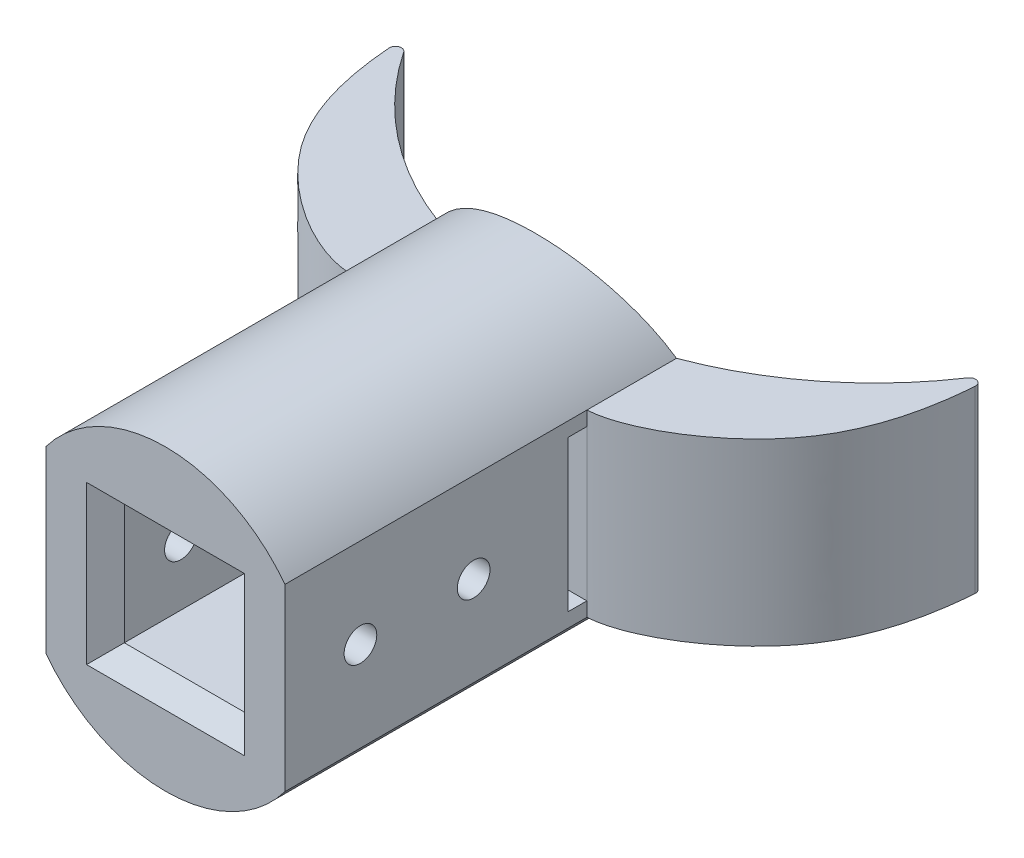
ISO-10303-21;
HEADER;
FILE_DESCRIPTION(('STEP AP214'),'2;1');
FILE_NAME('part.step','',(''),(''),'','','');
FILE_SCHEMA(('AUTOMOTIVE_DESIGN { 1 0 10303 214 1 1 1 1 }'));
ENDSEC;
DATA;
#1=APPLICATION_CONTEXT('core data for automotive mechanical design processes');
#2=APPLICATION_PROTOCOL_DEFINITION('international standard','automotive_design',2000,#1);
#3=PRODUCT_CONTEXT('',#1,'mechanical');
#4=PRODUCT('Part','Part','',(#3));
#5=PRODUCT_RELATED_PRODUCT_CATEGORY('part','',(#4));
#6=PRODUCT_DEFINITION_FORMATION('','',#4);
#7=PRODUCT_DEFINITION_CONTEXT('part definition',#1,'design');
#8=PRODUCT_DEFINITION('design','',#6,#7);
#9=PRODUCT_DEFINITION_SHAPE('','',#8);
#10=(LENGTH_UNIT() NAMED_UNIT(*) SI_UNIT(.MILLI.,.METRE.));
#11=(NAMED_UNIT(*) PLANE_ANGLE_UNIT() SI_UNIT($,.RADIAN.));
#12=(NAMED_UNIT(*) SI_UNIT($,.STERADIAN.) SOLID_ANGLE_UNIT());
#13=UNCERTAINTY_MEASURE_WITH_UNIT(LENGTH_MEASURE(1.E-05),#10,'distance_accuracy_value','');
#14=(GEOMETRIC_REPRESENTATION_CONTEXT(3) GLOBAL_UNCERTAINTY_ASSIGNED_CONTEXT((#13)) GLOBAL_UNIT_ASSIGNED_CONTEXT((#10,
#11,#12)) REPRESENTATION_CONTEXT('',''));
#15=CARTESIAN_POINT('',(0.,0.,0.));
#16=DIRECTION('',(0.,0.,1.));
#17=DIRECTION('',(1.,0.,0.));
#18=AXIS2_PLACEMENT_3D('',#15,#16,#17);
#19=CARTESIAN_POINT('',(10.1,35.2,-68.58));
#20=DIRECTION('',(0.,-1.,0.));
#21=DIRECTION('',(0.,0.,-1.));
#22=AXIS2_PLACEMENT_3D('',#19,#20,#21);
#23=CYLINDRICAL_SURFACE('',#22,57.15);
#24=CARTESIAN_POINT('',(10.1,-5.00000000000001,-68.58));
#25=DIRECTION('',(0.,1.,0.));
#26=DIRECTION('',(-1.,0.,0.));
#27=AXIS2_PLACEMENT_3D('',#24,#25,#26);
#28=CIRCLE('',#27,57.15);
#29=CARTESIAN_POINT('',(57.5657270757982,-5.,-36.7503400400533));
#30=VERTEX_POINT('',#29);
#31=CARTESIAN_POINT('',(30.2,-5.00000000000001,-15.0812850621625));
#32=VERTEX_POINT('',#31);
#33=EDGE_CURVE('E186',#30,#32,#28,.F.);
#34=ORIENTED_EDGE('',*,*,#33,.T.);
#35=CARTESIAN_POINT('',(-10.,-5.,-15.0812850621625));
#36=CARTESIAN_POINT('',(-9.569712332474,-5.56898872498957,-14.9196018283171));
#37=CARTESIAN_POINT('',(-9.11570132508639,-6.11911007857149,-14.7549670228426));
#38=CARTESIAN_POINT('',(-8.1629020495651,-7.17877848018616,-14.4242740941071));
#39=CARTESIAN_POINT('',(-7.66410811291156,-7.68832037631784,-14.2582157930764));
#40=CARTESIAN_POINT('',(-6.62262711435152,-8.66562351070631,-13.9285989864008));
#41=CARTESIAN_POINT('',(-6.07978660329882,-9.13322559182999,-13.765051806664));
#42=CARTESIAN_POINT('',(-5.23631168187311,-9.79927875036689,-13.5254310400344));
#43=CARTESIAN_POINT('',(-4.95028103813122,-10.0154069948205,-13.4465066138825));
#44=CARTESIAN_POINT('',(-4.36874205010276,-10.4356196002812,-13.2910442377158));
#45=CARTESIAN_POINT('',(-4.07323096328791,-10.6397004267944,-13.214506991132));
#46=CARTESIAN_POINT('',(-3.17219476778227,-11.2338693501222,-12.9890394362993));
#47=CARTESIAN_POINT('',(-2.55303439979543,-11.6051982189992,-12.8445023563047));
#48=CARTESIAN_POINT('',(-1.28240554188028,-12.2945740973537,-12.5712019196849));
#49=CARTESIAN_POINT('',(-0.630939178220956,-12.6126246074125,-12.4424375268865));
#50=CARTESIAN_POINT('',(0.366313383086268,-13.047117571051,-12.2640011701088));
#51=CARTESIAN_POINT('',(0.701706915265925,-13.1847280127073,-12.2070267275089));
#52=CARTESIAN_POINT('',(1.37875278707901,-13.4455707189697,-12.0983222412656));
#53=CARTESIAN_POINT('',(1.72040335199784,-13.5688069896999,-12.046590736929));
#54=CARTESIAN_POINT('',(2.75387813261316,-13.9164551255889,-11.8998412868026));
#55=CARTESIAN_POINT('',(3.45450132396692,-14.1189266643058,-11.8132185599554));
#56=CARTESIAN_POINT('',(4.64729128605659,-14.4080583604874,-11.6886347494299));
#57=CARTESIAN_POINT('',(5.13490275445733,-14.5110720990149,-11.6439587541232));
#58=CARTESIAN_POINT('',(6.11643079176066,-14.6881513850773,-11.5668799121503));
#59=CARTESIAN_POINT('',(6.61034811312223,-14.7622134439147,-11.5344785445999));
#60=CARTESIAN_POINT('',(7.60253922548987,-14.8809199087936,-11.4824337012582));
#61=CARTESIAN_POINT('',(8.10081442174288,-14.9255544423898,-11.4627945069954));
#62=CARTESIAN_POINT('',(9.09937599308318,-14.9850937460932,-11.4365773552659));
#63=CARTESIAN_POINT('',(9.5996620242112,-15.0000034005777,-11.4299972519366));
#64=CARTESIAN_POINT('',(10.7725165281108,-14.9999954292002,-11.4300036937393));
#65=CARTESIAN_POINT('',(11.4451269031158,-14.9730478794715,-11.4419004319034));
#66=CARTESIAN_POINT('',(12.7852853183273,-14.8655438624096,-11.4891812618554));
#67=CARTESIAN_POINT('',(13.4528323795908,-14.7849772827524,-11.5245697840919));
#68=CARTESIAN_POINT('',(14.7782037382921,-14.5710650327966,-11.6179207755132));
#69=CARTESIAN_POINT('',(15.4360222289414,-14.4376890638022,-11.6758962033327));
#70=CARTESIAN_POINT('',(16.7368192066626,-14.1195775410837,-11.8129066183442));
#71=CARTESIAN_POINT('',(17.379798343343,-13.9348442402179,-11.8919406817646));
#72=CARTESIAN_POINT('',(18.6447047616331,-13.5164901500572,-12.0687876549313));
#73=CARTESIAN_POINT('',(19.2666912640775,-13.2830230952584,-12.1665414336075));
#74=CARTESIAN_POINT('',(20.4879279453276,-12.7689387971464,-12.378597790476));
#75=CARTESIAN_POINT('',(21.0871775251444,-12.4883203127165,-12.4929008042652));
#76=CARTESIAN_POINT('',(22.2598524960107,-11.8820522652358,-12.7354012662615));
#77=CARTESIAN_POINT('',(22.8332653894269,-11.5563812130397,-12.8636053386399));
#78=CARTESIAN_POINT('',(23.9509956391608,-10.8624490827969,-13.1309006195354));
#79=CARTESIAN_POINT('',(24.4953141314787,-10.4941896694051,-13.2699914024539));
#80=CARTESIAN_POINT('',(25.5153268978302,-9.74455161689717,-13.5459234316245));
#81=CARTESIAN_POINT('',(25.9931591308689,-9.36588348711492,-13.6822438766443));
#82=CARTESIAN_POINT('',(26.9194626456226,-8.57558875333205,-13.9589249731525));
#83=CARTESIAN_POINT('',(27.3679351546028,-8.1639635285711,-14.0992854554098));
#84=CARTESIAN_POINT('',(28.2328668507241,-7.31043221696037,-14.3810328261166));
#85=CARTESIAN_POINT('',(28.6493879121895,-6.86858795977308,-14.5224171191221));
#86=CARTESIAN_POINT('',(29.4496851700661,-5.95571957094113,-14.8036816275328));
#87=CARTESIAN_POINT('',(29.8334608987263,-5.48469502263603,-14.9435618214278));
#88=CARTESIAN_POINT('',(30.2,-5.00000000000001,-15.0812850621625));
#89=B_SPLINE_CURVE_WITH_KNOTS('',3,(#35,#36,#37,#38,#39,#40,#41,#42,#43,#44,#45,#46,#47,#48,#49,
#50,#51,#52,#53,#54,#55,#56,#57,#58,#59,#60,#61,#62,#63,#64,#65,#66,#67,#68,#69,#70,#71,#72,#73,
#74,#75,#76,#77,#78,#79,#80,#81,#82,#83,#84,#85,#86,#87,#88),.UNSPECIFIED.,.F.,.F.,(4,2,2,2,2,2,
2,2,2,2,2,2,2,2,2,2,2,2,2,2,2,2,2,2,2,2,4),(0.,2.1936380553368,4.38755416883547,
6.58947177679666,7.69045483028555,8.79175930316771,10.9977578031182,13.2036113040757,
14.3042068886823,15.4044949973573,17.6041592018719,19.1043800548913,20.6047816298777,
22.1056863088473,23.606344339566,25.6234155544972,27.6408672884359,29.6594781900542,
31.6780005565699,33.6902490441192,35.7025505062395,37.7158151254793,39.7290010786523,
41.6016475353139,43.4742156634823,45.3430608618205,47.211932751237),.UNSPECIFIED.);
#90=CARTESIAN_POINT('',(-10.,-5.00000000000001,-15.0812850621625));
#91=VERTEX_POINT('',#90);
#92=EDGE_CURVE('E170',#91,#32,#89,.T.);
#93=ORIENTED_EDGE('',*,*,#92,.F.);
#94=CARTESIAN_POINT('',(10.1,-5.,-68.58));
#95=DIRECTION('',(0.,-1.,0.));
#96=DIRECTION('',(1.,0.,0.));
#97=AXIS2_PLACEMENT_3D('',#94,#95,#96);
#98=CIRCLE('',#97,57.15);
#99=CARTESIAN_POINT('',(-37.3657270757982,-5.,-36.7503400400533));
#100=VERTEX_POINT('',#99);
#101=EDGE_CURVE('E182',#100,#91,#98,.F.);
#102=ORIENTED_EDGE('',*,*,#101,.F.);
#103=DIRECTION('',(0.,-1.,0.));
#104=VECTOR('',#103,1.);
#105=CARTESIAN_POINT('',(-37.3657270757982,35.2,-36.7503400400533));
#106=LINE('',#105,#104);
#107=CARTESIAN_POINT('',(-37.3657270757982,25.2,-36.7503400400533));
#108=VERTEX_POINT('',#107);
#109=EDGE_CURVE('E447',#108,#100,#106,.T.);
#110=ORIENTED_EDGE('',*,*,#109,.F.);
#111=CARTESIAN_POINT('',(10.1,25.2,-68.58));
#112=DIRECTION('',(0.,-1.,0.));
#113=DIRECTION('',(1.,0.,0.));
#114=AXIS2_PLACEMENT_3D('',#111,#112,#113);
#115=CIRCLE('',#114,57.15);
#116=CARTESIAN_POINT('',(-9.99999999999999,25.2,-15.0812850621625));
#117=VERTEX_POINT('',#116);
#118=EDGE_CURVE('E252',#108,#117,#115,.F.);
#119=ORIENTED_EDGE('',*,*,#118,.T.);
#120=CARTESIAN_POINT('',(30.2,25.2,-15.0812850621625));
#121=CARTESIAN_POINT('',(29.769712332474,25.7689887249896,-14.919601828317));
#122=CARTESIAN_POINT('',(29.3157013250864,26.3191100785715,-14.7549670228426));
#123=CARTESIAN_POINT('',(28.3629020495651,27.3787784801862,-14.4242740941071));
#124=CARTESIAN_POINT('',(27.8641081129116,27.8883203763178,-14.2582157930764));
#125=CARTESIAN_POINT('',(26.8226271143515,28.8656235107063,-13.9285989864008));
#126=CARTESIAN_POINT('',(26.2797866032988,29.33322559183,-13.765051806664));
#127=CARTESIAN_POINT('',(25.4363116818731,29.9992787503669,-13.5254310400344));
#128=CARTESIAN_POINT('',(25.1502810381312,30.2154069948205,-13.4465066138825));
#129=CARTESIAN_POINT('',(24.5687420501028,30.6356196002812,-13.2910442377158));
#130=CARTESIAN_POINT('',(24.2732309632879,30.8397004267944,-13.214506991132));
#131=CARTESIAN_POINT('',(23.3721947677823,31.4338693501222,-12.9890394362993));
#132=CARTESIAN_POINT('',(22.7530343997954,31.8051982189992,-12.8445023563047));
#133=CARTESIAN_POINT('',(21.4824055418803,32.4945740973537,-12.5712019196849));
#134=CARTESIAN_POINT('',(20.830939178221,32.8126246074124,-12.4424375268865));
#135=CARTESIAN_POINT('',(19.8336866169137,33.247117571051,-12.2640011701088));
#136=CARTESIAN_POINT('',(19.4982930847341,33.3847280127073,-12.2070267275089));
#137=CARTESIAN_POINT('',(18.821247212921,33.6455707189697,-12.0983222412656));
#138=CARTESIAN_POINT('',(18.4795966480022,33.7688069896999,-12.046590736929));
#139=CARTESIAN_POINT('',(17.4461218673868,34.1164551255889,-11.8998412868026));
#140=CARTESIAN_POINT('',(16.7454986760331,34.3189266643058,-11.8132185599555));
#141=CARTESIAN_POINT('',(15.5527087139434,34.6080583604874,-11.6886347494299));
#142=CARTESIAN_POINT('',(15.0650972455427,34.7110720990149,-11.6439587541232));
#143=CARTESIAN_POINT('',(14.0835692082393,34.8881513850773,-11.5668799121503));
#144=CARTESIAN_POINT('',(13.5896518868778,34.9622134439147,-11.5344785445999));
#145=CARTESIAN_POINT('',(12.5974607745101,35.0809199087936,-11.4824337012582));
#146=CARTESIAN_POINT('',(12.0991855782571,35.1255544423898,-11.4627945069954));
#147=CARTESIAN_POINT('',(11.1006240069168,35.1850937460932,-11.4365773552659));
#148=CARTESIAN_POINT('',(10.6003379757888,35.2000034005777,-11.4299972519366));
#149=CARTESIAN_POINT('',(9.42748347188917,35.1999954292002,-11.4300036937393));
#150=CARTESIAN_POINT('',(8.75487309688416,35.1730478794715,-11.4419004319034));
#151=CARTESIAN_POINT('',(7.41471468167267,35.0655438624096,-11.4891812618554));
#152=CARTESIAN_POINT('',(6.74716762040917,34.9849772827524,-11.5245697840919));
#153=CARTESIAN_POINT('',(5.4217962617079,34.7710650327966,-11.6179207755132));
#154=CARTESIAN_POINT('',(4.76397777105858,34.6376890638021,-11.6758962033327));
#155=CARTESIAN_POINT('',(3.46318079333738,34.3195775410837,-11.8129066183442));
#156=CARTESIAN_POINT('',(2.82020165665698,34.1348442402179,-11.8919406817645));
#157=CARTESIAN_POINT('',(1.55529523836689,33.7164901500572,-12.0687876549313));
#158=CARTESIAN_POINT('',(0.933308735922529,33.4830230952584,-12.1665414336075));
#159=CARTESIAN_POINT('',(-0.287927945327568,32.9689387971464,-12.378597790476));
#160=CARTESIAN_POINT('',(-0.887177525144446,32.6883203127164,-12.4929008042652));
#161=CARTESIAN_POINT('',(-2.05985249601069,32.0820522652358,-12.7354012662615));
#162=CARTESIAN_POINT('',(-2.63326538942687,31.7563812130397,-12.8636053386399));
#163=CARTESIAN_POINT('',(-3.75099563916081,31.0624490827969,-13.1309006195354));
#164=CARTESIAN_POINT('',(-4.29531413147871,30.6941896694051,-13.2699914024539));
#165=CARTESIAN_POINT('',(-5.31532689783022,29.9445516168972,-13.5459234316245));
#166=CARTESIAN_POINT('',(-5.79315913086887,29.5658834871149,-13.6822438766443));
#167=CARTESIAN_POINT('',(-6.71946264562263,28.775588753332,-13.9589249731525));
#168=CARTESIAN_POINT('',(-7.16793515460278,28.3639635285711,-14.0992854554098));
#169=CARTESIAN_POINT('',(-8.03286685072415,27.5104322169604,-14.3810328261166));
#170=CARTESIAN_POINT('',(-8.44938791218949,27.0685879597731,-14.5224171191221));
#171=CARTESIAN_POINT('',(-9.24968517006615,26.1557195709411,-14.8036816275328));
#172=CARTESIAN_POINT('',(-9.63346089872629,25.684695022636,-14.9435618214278));
#173=CARTESIAN_POINT('',(-9.99999999999999,25.2,-15.0812850621625));
#174=B_SPLINE_CURVE_WITH_KNOTS('',3,(#120,#121,#122,#123,#124,#125,#126,#127,#128,#129,#130,
#131,#132,#133,#134,#135,#136,#137,#138,#139,#140,#141,#142,#143,#144,#145,#146,#147,#148,#149,
#150,#151,#152,#153,#154,#155,#156,#157,#158,#159,#160,#161,#162,#163,#164,#165,#166,#167,#168,
#169,#170,#171,#172,#173),.UNSPECIFIED.,.F.,.F.,(4,2,2,2,2,2,2,2,2,2,2,2,2,2,2,2,2,2,2,2,2,2,2,
2,2,2,4),(0.,2.1936380553368,4.38755416883547,6.58947177679666,7.69045483028554,
8.79175930316771,10.9977578031182,13.2036113040757,14.3042068886823,15.4044949973573,
17.6041592018719,19.1043800548913,20.6047816298777,22.1056863088473,23.606344339566,
25.6234155544972,27.6408672884359,29.6594781900543,31.6780005565699,33.6902490441192,
35.7025505062395,37.7158151254793,39.7290010786523,41.6016475353139,43.4742156634823,
45.3430608618205,47.211932751237),.UNSPECIFIED.);
#175=CARTESIAN_POINT('',(30.2,25.2,-15.0812850621625));
#176=VERTEX_POINT('',#175);
#177=EDGE_CURVE('E244',#176,#117,#174,.T.);
#178=ORIENTED_EDGE('',*,*,#177,.F.);
#179=CARTESIAN_POINT('',(10.1,25.2,-68.58));
#180=DIRECTION('',(0.,1.,0.));
#181=DIRECTION('',(-1.,0.,0.));
#182=AXIS2_PLACEMENT_3D('',#179,#180,#181);
#183=CIRCLE('',#182,57.15);
#184=CARTESIAN_POINT('',(57.5657270757982,25.2,-36.7503400400533));
#185=VERTEX_POINT('',#184);
#186=EDGE_CURVE('E581',#185,#176,#183,.F.);
#187=ORIENTED_EDGE('',*,*,#186,.F.);
#188=DIRECTION('',(0.,-1.,0.));
#189=VECTOR('',#188,1.);
#190=CARTESIAN_POINT('',(57.5657270757982,35.2,-36.7503400400533));
#191=LINE('',#190,#189);
#192=EDGE_CURVE('E195',#185,#30,#191,.T.);
#193=ORIENTED_EDGE('',*,*,#192,.T.);
#194=EDGE_LOOP('',(#34,#93,#102,#110,#119,#178,#187,#193));
#195=FACE_BOUND('',#194,.T.);
#196=ADVANCED_FACE('F32',(#195),#23,.F.);
#197=CARTESIAN_POINT('',(-38.196273481324,35.2,-36.193390609433));
#198=DIRECTION('',(0.,-1.,0.));
#199=DIRECTION('',(0.,0.,-1.));
#200=AXIS2_PLACEMENT_3D('',#197,#198,#199);
#201=CYLINDRICAL_SURFACE('',#200,0.999999999999999);
#202=CARTESIAN_POINT('',(-38.196273481324,-5.,-36.193390609433));
#203=DIRECTION('',(0.,-1.,0.));
#204=DIRECTION('',(1.,0.,0.));
#205=AXIS2_PLACEMENT_3D('',#202,#203,#204);
#206=CIRCLE('',#205,0.999999999999999);
#207=CARTESIAN_POINT('',(-39.1935140373091,-5.,-36.1191526575582));
#208=VERTEX_POINT('',#207);
#209=EDGE_CURVE('E209',#208,#100,#206,.T.);
#210=ORIENTED_EDGE('',*,*,#209,.F.);
#211=DIRECTION('',(0.,-1.,0.));
#212=VECTOR('',#211,1.);
#213=CARTESIAN_POINT('',(-39.1935140373091,35.2,-36.1191526575582));
#214=LINE('',#213,#212);
#215=CARTESIAN_POINT('',(-39.1935140373091,25.2,-36.1191526575582));
#216=VERTEX_POINT('',#215);
#217=EDGE_CURVE('E319',#216,#208,#214,.T.);
#218=ORIENTED_EDGE('',*,*,#217,.F.);
#219=CARTESIAN_POINT('',(-38.196273481324,25.2,-36.193390609433));
#220=DIRECTION('',(0.,-1.,0.));
#221=DIRECTION('',(1.,0.,0.));
#222=AXIS2_PLACEMENT_3D('',#219,#220,#221);
#223=CIRCLE('',#222,0.999999999999999);
#224=EDGE_CURVE('E429',#216,#108,#223,.T.);
#225=ORIENTED_EDGE('',*,*,#224,.T.);
#226=ORIENTED_EDGE('',*,*,#109,.T.);
#227=EDGE_LOOP('',(#210,#218,#225,#226));
#228=FACE_BOUND('',#227,.T.);
#229=ADVANCED_FACE('F384',(#228),#201,.T.);
#230=CARTESIAN_POINT('',(-39.1935140373091,35.2,-36.1191526575582));
#231=CARTESIAN_POINT('',(-38.7339626357244,35.2,-29.9459853806289));
#232=CARTESIAN_POINT('',(-35.680340128179,35.2,-11.9877721604459));
#233=CARTESIAN_POINT('',(-16.4831344739887,35.2,-0.377878078658248));
#234=CARTESIAN_POINT('',(-10.,35.2,0.));
#235=B_SPLINE_CURVE_WITH_KNOTS('',3,(#230,#231,#232,#233,#234),.UNSPECIFIED.,.F.,.F.,(4,1,4),
(0.,0.379882707345245,0.846265586941312),.UNSPECIFIED.);
#236=DIRECTION('',(0.,-1.,0.));
#237=VECTOR('',#236,1.);
#238=SURFACE_OF_LINEAR_EXTRUSION('',#235,#237);
#239=CARTESIAN_POINT('',(-39.1935140373091,-5.,-36.1191526575582));
#240=CARTESIAN_POINT('',(-38.7339626357244,-5.,-29.9459853806289));
#241=CARTESIAN_POINT('',(-35.680340128179,-5.,-11.9877721604459));
#242=CARTESIAN_POINT('',(-16.4831344739887,-5.,-0.377878078658248));
#243=CARTESIAN_POINT('',(-10.,-5.,0.));
#244=B_SPLINE_CURVE_WITH_KNOTS('',3,(#239,#240,#241,#242,#243),.UNSPECIFIED.,.F.,.F.,(4,1,4),
(0.,0.379882707345245,0.846265586941312),.UNSPECIFIED.);
#245=CARTESIAN_POINT('',(-10.,-5.00000000000001,0.));
#246=VERTEX_POINT('',#245);
#247=EDGE_CURVE('E197',#246,#208,#244,.F.);
#248=ORIENTED_EDGE('',*,*,#247,.F.);
#249=DIRECTION('',(0.,-1.,0.));
#250=VECTOR('',#249,1.);
#251=CARTESIAN_POINT('',(-10.,-5.,0.));
#252=LINE('',#251,#250);
#253=CARTESIAN_POINT('',(-10.,-2.6,0.));
#254=VERTEX_POINT('',#253);
#255=EDGE_CURVE('E462',#254,#246,#252,.T.);
#256=ORIENTED_EDGE('',*,*,#255,.F.);
#257=DIRECTION('',(0.,-1.,0.));
#258=VECTOR('',#257,1.);
#259=CARTESIAN_POINT('',(-10.,22.8,0.));
#260=LINE('',#259,#258);
#261=CARTESIAN_POINT('',(-10.,22.8,0.));
#262=VERTEX_POINT('',#261);
#263=EDGE_CURVE('E277',#262,#254,#260,.T.);
#264=ORIENTED_EDGE('',*,*,#263,.F.);
#265=CARTESIAN_POINT('',(-9.99999999999999,25.2,0.));
#266=VERTEX_POINT('',#265);
#267=EDGE_CURVE('E443',#266,#262,#252,.T.);
#268=ORIENTED_EDGE('',*,*,#267,.F.);
#269=CARTESIAN_POINT('',(-39.1935140373091,25.2,-36.1191526575582));
#270=CARTESIAN_POINT('',(-38.7339626357244,25.2,-29.9459853806289));
#271=CARTESIAN_POINT('',(-35.680340128179,25.2,-11.9877721604459));
#272=CARTESIAN_POINT('',(-16.4831344739887,25.2,-0.377878078658248));
#273=CARTESIAN_POINT('',(-10.,25.2,0.));
#274=B_SPLINE_CURVE_WITH_KNOTS('',3,(#269,#270,#271,#272,#273),.UNSPECIFIED.,.F.,.F.,(4,1,4),
(0.,0.379882707345245,0.846265586941312),.UNSPECIFIED.);
#275=EDGE_CURVE('E432',#266,#216,#274,.F.);
#276=ORIENTED_EDGE('',*,*,#275,.T.);
#277=ORIENTED_EDGE('',*,*,#217,.T.);
#278=EDGE_LOOP('',(#248,#256,#264,#268,#276,#277));
#279=FACE_BOUND('',#278,.T.);
#280=ADVANCED_FACE('F336',(#279),#238,.F.);
#281=CARTESIAN_POINT('',(30.2,35.2,0.));
#282=CARTESIAN_POINT('',(36.6831344739887,35.2,-0.377878078658248));
#283=CARTESIAN_POINT('',(55.880340128179,35.2,-11.9877721604459));
#284=CARTESIAN_POINT('',(58.9339626357243,35.2,-29.945985380629));
#285=CARTESIAN_POINT('',(59.3935140373091,35.2,-36.1191526575582));
#286=B_SPLINE_CURVE_WITH_KNOTS('',3,(#281,#282,#283,#284,#285),.UNSPECIFIED.,.F.,.F.,(4,1,4),
(0.,0.466382879596067,0.846265586941312),.UNSPECIFIED.);
#287=DIRECTION('',(0.,-1.,0.));
#288=VECTOR('',#287,1.);
#289=SURFACE_OF_LINEAR_EXTRUSION('',#286,#288);
#290=DIRECTION('',(0.,1.,0.));
#291=VECTOR('',#290,1.);
#292=CARTESIAN_POINT('',(30.2,-5.,0.));
#293=LINE('',#292,#291);
#294=CARTESIAN_POINT('',(30.2,-5.,0.));
#295=VERTEX_POINT('',#294);
#296=CARTESIAN_POINT('',(30.2,-2.6,0.));
#297=VERTEX_POINT('',#296);
#298=EDGE_CURVE('E467',#295,#297,#293,.T.);
#299=ORIENTED_EDGE('',*,*,#298,.F.);
#300=CARTESIAN_POINT('',(30.2,-5.00000000000001,0.));
#301=CARTESIAN_POINT('',(36.6831344739887,-5.00000000000001,-0.377878078658248));
#302=CARTESIAN_POINT('',(55.880340128179,-5.00000000000001,-11.9877721604459));
#303=CARTESIAN_POINT('',(58.9339626357243,-5.00000000000001,-29.945985380629));
#304=CARTESIAN_POINT('',(59.3935140373091,-5.00000000000001,-36.1191526575582));
#305=B_SPLINE_CURVE_WITH_KNOTS('',3,(#300,#301,#302,#303,#304),.UNSPECIFIED.,.F.,.F.,(4,1,4),
(0.,0.466382879596067,0.846265586941312),.UNSPECIFIED.);
#306=CARTESIAN_POINT('',(59.3935140373091,-5.,-36.1191526575582));
#307=VERTEX_POINT('',#306);
#308=EDGE_CURVE('E189',#295,#307,#305,.T.);
#309=ORIENTED_EDGE('',*,*,#308,.T.);
#310=DIRECTION('',(0.,-1.,0.));
#311=VECTOR('',#310,1.);
#312=CARTESIAN_POINT('',(59.3935140373091,35.2,-36.1191526575582));
#313=LINE('',#312,#311);
#314=CARTESIAN_POINT('',(59.3935140373091,25.2,-36.1191526575582));
#315=VERTEX_POINT('',#314);
#316=EDGE_CURVE('E451',#315,#307,#313,.T.);
#317=ORIENTED_EDGE('',*,*,#316,.F.);
#318=CARTESIAN_POINT('',(30.2,25.2,0.));
#319=CARTESIAN_POINT('',(36.6831344739887,25.2,-0.377878078658248));
#320=CARTESIAN_POINT('',(55.880340128179,25.2,-11.9877721604459));
#321=CARTESIAN_POINT('',(58.9339626357243,25.2,-29.945985380629));
#322=CARTESIAN_POINT('',(59.3935140373091,25.2,-36.1191526575582));
#323=B_SPLINE_CURVE_WITH_KNOTS('',3,(#318,#319,#320,#321,#322),.UNSPECIFIED.,.F.,.F.,(4,1,4),
(0.,0.466382879596067,0.846265586941312),.UNSPECIFIED.);
#324=CARTESIAN_POINT('',(30.2,25.2,0.));
#325=VERTEX_POINT('',#324);
#326=EDGE_CURVE('E559',#325,#315,#323,.T.);
#327=ORIENTED_EDGE('',*,*,#326,.F.);
#328=CARTESIAN_POINT('',(30.2,22.8,0.));
#329=VERTEX_POINT('',#328);
#330=EDGE_CURVE('E480',#329,#325,#293,.T.);
#331=ORIENTED_EDGE('',*,*,#330,.F.);
#332=DIRECTION('',(0.,-1.,0.));
#333=VECTOR('',#332,1.);
#334=CARTESIAN_POINT('',(30.2,35.2,0.));
#335=LINE('',#334,#333);
#336=EDGE_CURVE('E304',#329,#297,#335,.T.);
#337=ORIENTED_EDGE('',*,*,#336,.T.);
#338=EDGE_LOOP('',(#299,#309,#317,#327,#331,#337));
#339=FACE_BOUND('',#338,.T.);
#340=ADVANCED_FACE('F332',(#339),#289,.F.);
#341=CARTESIAN_POINT('',(58.396273481324,35.2,-36.1933906094331));
#342=DIRECTION('',(0.,-1.,0.));
#343=DIRECTION('',(0.,0.,-1.));
#344=AXIS2_PLACEMENT_3D('',#341,#342,#343);
#345=CYLINDRICAL_SURFACE('',#344,0.999999999999998);
#346=ORIENTED_EDGE('',*,*,#316,.T.);
#347=CARTESIAN_POINT('',(58.396273481324,-5.,-36.1933906094331));
#348=DIRECTION('',(0.,1.,0.));
#349=DIRECTION('',(-1.,0.,0.));
#350=AXIS2_PLACEMENT_3D('',#347,#348,#349);
#351=CIRCLE('',#350,0.999999999999998);
#352=EDGE_CURVE('E190',#307,#30,#351,.T.);
#353=ORIENTED_EDGE('',*,*,#352,.T.);
#354=ORIENTED_EDGE('',*,*,#192,.F.);
#355=CARTESIAN_POINT('',(58.396273481324,25.2,-36.1933906094331));
#356=DIRECTION('',(0.,1.,0.));
#357=DIRECTION('',(-1.,0.,0.));
#358=AXIS2_PLACEMENT_3D('',#355,#356,#357);
#359=CIRCLE('',#358,0.999999999999998);
#360=EDGE_CURVE('E561',#315,#185,#359,.T.);
#361=ORIENTED_EDGE('',*,*,#360,.F.);
#362=EDGE_LOOP('',(#346,#353,#354,#361));
#363=FACE_BOUND('',#362,.T.);
#364=ADVANCED_FACE('F335',(#363),#345,.T.);
#365=CARTESIAN_POINT('',(30.2,-5.,50.8));
#366=DIRECTION('',(-1.,0.,0.));
#367=DIRECTION('',(0.,0.,1.));
#368=AXIS2_PLACEMENT_3D('',#365,#366,#367);
#369=PLANE('',#368);
#370=CARTESIAN_POINT('',(30.2,10.1,19.05));
#371=DIRECTION('',(1.,0.,0.));
#372=DIRECTION('',(0.,0.,-1.));
#373=AXIS2_PLACEMENT_3D('',#370,#371,#372);
#374=CIRCLE('',#373,2.74999999999999);
#375=CARTESIAN_POINT('',(30.2,10.1,16.3));
#376=VERTEX_POINT('',#375);
#377=EDGE_CURVE('E266',#376,#376,#374,.T.);
#378=ORIENTED_EDGE('',*,*,#377,.F.);
#379=EDGE_LOOP('',(#378));
#380=FACE_BOUND('',#379,.T.);
#381=DIRECTION('',(0.,1.,0.));
#382=VECTOR('',#381,1.);
#383=CARTESIAN_POINT('',(30.2,-5.00000000000001,3.2));
#384=LINE('',#383,#382);
#385=CARTESIAN_POINT('',(30.2,-2.6,3.2));
#386=VERTEX_POINT('',#385);
#387=CARTESIAN_POINT('',(30.2,22.8,3.2));
#388=VERTEX_POINT('',#387);
#389=EDGE_CURVE('E316',#386,#388,#384,.T.);
#390=ORIENTED_EDGE('',*,*,#389,.T.);
#391=DIRECTION('',(0.,0.,-1.));
#392=VECTOR('',#391,1.);
#393=CARTESIAN_POINT('',(30.2,22.8,50.8));
#394=LINE('',#393,#392);
#395=EDGE_CURVE('E301',#388,#329,#394,.T.);
#396=ORIENTED_EDGE('',*,*,#395,.T.);
#397=ORIENTED_EDGE('',*,*,#330,.T.);
#398=DIRECTION('',(0.,0.,-1.));
#399=VECTOR('',#398,1.);
#400=CARTESIAN_POINT('',(30.2,25.2,50.8));
#401=LINE('',#400,#399);
#402=CARTESIAN_POINT('',(30.2,25.2,50.8));
#403=VERTEX_POINT('',#402);
#404=EDGE_CURVE('E475',#403,#325,#401,.T.);
#405=ORIENTED_EDGE('',*,*,#404,.F.);
#406=DIRECTION('',(0.,1.,0.));
#407=VECTOR('',#406,1.);
#408=CARTESIAN_POINT('',(30.2,-5.,50.8));
#409=LINE('',#408,#407);
#410=CARTESIAN_POINT('',(30.2,-5.,50.8));
#411=VERTEX_POINT('',#410);
#412=EDGE_CURVE('E466',#411,#403,#409,.T.);
#413=ORIENTED_EDGE('',*,*,#412,.F.);
#414=DIRECTION('',(0.,0.,-1.));
#415=VECTOR('',#414,1.);
#416=CARTESIAN_POINT('',(30.2,-5.,50.8));
#417=LINE('',#416,#415);
#418=EDGE_CURVE('E471',#411,#295,#417,.T.);
#419=ORIENTED_EDGE('',*,*,#418,.T.);
#420=ORIENTED_EDGE('',*,*,#298,.T.);
#421=DIRECTION('',(0.,0.,1.));
#422=VECTOR('',#421,1.);
#423=CARTESIAN_POINT('',(30.2,-2.59999999999997,50.8));
#424=LINE('',#423,#422);
#425=EDGE_CURVE('E293',#297,#386,#424,.T.);
#426=ORIENTED_EDGE('',*,*,#425,.T.);
#427=EDGE_LOOP('',(#390,#396,#397,#405,#413,#419,#420,#426));
#428=FACE_BOUND('',#427,.T.);
#429=CARTESIAN_POINT('',(30.2,10.1,38.1));
#430=DIRECTION('',(1.,0.,0.));
#431=DIRECTION('',(0.,0.,-1.));
#432=AXIS2_PLACEMENT_3D('',#429,#430,#431);
#433=CIRCLE('',#432,2.74999999999999);
#434=CARTESIAN_POINT('',(30.2,10.1,35.35));
#435=VERTEX_POINT('',#434);
#436=EDGE_CURVE('E257',#435,#435,#433,.T.);
#437=ORIENTED_EDGE('',*,*,#436,.F.);
#438=EDGE_LOOP('',(#437));
#439=FACE_BOUND('',#438,.T.);
#440=ADVANCED_FACE('F358',(#380,#428,#439),#369,.F.);
#441=CARTESIAN_POINT('',(0.,0.,50.8));
#442=DIRECTION('',(0.,0.,-1.));
#443=DIRECTION('',(-1.,0.,0.));
#444=AXIS2_PLACEMENT_3D('',#441,#442,#443);
#445=PLANE('',#444);
#446=DIRECTION('',(1.,0.,0.));
#447=VECTOR('',#446,1.);
#448=CARTESIAN_POINT('',(20.2,23.3750000000001,50.8));
#449=LINE('',#448,#447);
#450=CARTESIAN_POINT('',(-3.17500000000005,23.3750000000001,50.8));
#451=VERTEX_POINT('',#450);
#452=CARTESIAN_POINT('',(23.3750000000001,23.3750000000001,50.8));
#453=VERTEX_POINT('',#452);
#454=EDGE_CURVE('E497',#451,#453,#449,.T.);
#455=ORIENTED_EDGE('',*,*,#454,.T.);
#456=DIRECTION('',(0.,-1.,0.));
#457=VECTOR('',#456,1.);
#458=CARTESIAN_POINT('',(23.3750000000001,0.,50.8));
#459=LINE('',#458,#457);
#460=CARTESIAN_POINT('',(23.3750000000001,-3.17500000000005,50.8));
#461=VERTEX_POINT('',#460);
#462=EDGE_CURVE('E503',#453,#461,#459,.T.);
#463=ORIENTED_EDGE('',*,*,#462,.T.);
#464=DIRECTION('',(-1.,0.,0.));
#465=VECTOR('',#464,1.);
#466=CARTESIAN_POINT('',(0.,-3.17500000000005,50.8));
#467=LINE('',#466,#465);
#468=CARTESIAN_POINT('',(-3.17500000000005,-3.17500000000005,50.8));
#469=VERTEX_POINT('',#468);
#470=EDGE_CURVE('E501',#461,#469,#467,.T.);
#471=ORIENTED_EDGE('',*,*,#470,.T.);
#472=DIRECTION('',(0.,1.,0.));
#473=VECTOR('',#472,1.);
#474=CARTESIAN_POINT('',(-3.17500000000005,20.2,50.8));
#475=LINE('',#474,#473);
#476=EDGE_CURVE('E499',#469,#451,#475,.T.);
#477=ORIENTED_EDGE('',*,*,#476,.T.);
#478=EDGE_LOOP('',(#455,#463,#471,#477));
#479=FACE_BOUND('',#478,.T.);
#480=DIRECTION('',(0.,-1.,0.));
#481=VECTOR('',#480,1.);
#482=CARTESIAN_POINT('',(-10.,-5.,50.8));
#483=LINE('',#482,#481);
#484=CARTESIAN_POINT('',(-10.,25.2,50.8));
#485=VERTEX_POINT('',#484);
#486=CARTESIAN_POINT('',(-10.,-5.,50.8));
#487=VERTEX_POINT('',#486);
#488=EDGE_CURVE('E463',#485,#487,#483,.T.);
#489=ORIENTED_EDGE('',*,*,#488,.T.);
#490=CARTESIAN_POINT('',(10.1,10.2005,50.8));
#491=DIRECTION('',(0.,0.,1.));
#492=DIRECTION('',(-1.,0.,0.));
#493=AXIS2_PLACEMENT_3D('',#490,#491,#492);
#494=CIRCLE('',#493,25.2005);
#495=EDGE_CURVE('E251',#487,#411,#494,.T.);
#496=ORIENTED_EDGE('',*,*,#495,.T.);
#497=ORIENTED_EDGE('',*,*,#412,.T.);
#498=CARTESIAN_POINT('',(10.1,9.99950000000002,50.8));
#499=DIRECTION('',(0.,0.,1.));
#500=DIRECTION('',(-1.,0.,0.));
#501=AXIS2_PLACEMENT_3D('',#498,#499,#500);
#502=CIRCLE('',#501,25.2005);
#503=EDGE_CURVE('E255',#403,#485,#502,.T.);
#504=ORIENTED_EDGE('',*,*,#503,.T.);
#505=EDGE_LOOP('',(#489,#496,#497,#504));
#506=FACE_BOUND('',#505,.T.);
#507=ADVANCED_FACE('F355',(#479,#506),#445,.F.);
#508=CARTESIAN_POINT('',(-10.,-5.,50.8));
#509=DIRECTION('',(1.,0.,0.));
#510=DIRECTION('',(0.,0.,-1.));
#511=AXIS2_PLACEMENT_3D('',#508,#509,#510);
#512=PLANE('',#511);
#513=CARTESIAN_POINT('',(-10.,10.1,38.1));
#514=DIRECTION('',(1.,0.,0.));
#515=DIRECTION('',(0.,0.,-1.));
#516=AXIS2_PLACEMENT_3D('',#513,#514,#515);
#517=CIRCLE('',#516,2.74999999999999);
#518=CARTESIAN_POINT('',(-10.,10.1,35.35));
#519=VERTEX_POINT('',#518);
#520=EDGE_CURVE('E263',#519,#519,#517,.T.);
#521=ORIENTED_EDGE('',*,*,#520,.T.);
#522=EDGE_LOOP('',(#521));
#523=FACE_BOUND('',#522,.T.);
#524=CARTESIAN_POINT('',(-10.,10.1,19.05));
#525=DIRECTION('',(1.,0.,0.));
#526=DIRECTION('',(0.,0.,-1.));
#527=AXIS2_PLACEMENT_3D('',#524,#525,#526);
#528=CIRCLE('',#527,2.74999999999999);
#529=CARTESIAN_POINT('',(-10.,10.1,16.3));
#530=VERTEX_POINT('',#529);
#531=EDGE_CURVE('E273',#530,#530,#528,.T.);
#532=ORIENTED_EDGE('',*,*,#531,.T.);
#533=EDGE_LOOP('',(#532));
#534=FACE_BOUND('',#533,.T.);
#535=ORIENTED_EDGE('',*,*,#267,.T.);
#536=DIRECTION('',(0.,0.,-1.));
#537=VECTOR('',#536,1.);
#538=CARTESIAN_POINT('',(-10.,22.8,0.));
#539=LINE('',#538,#537);
#540=CARTESIAN_POINT('',(-10.,22.8,3.2));
#541=VERTEX_POINT('',#540);
#542=EDGE_CURVE('E287',#541,#262,#539,.T.);
#543=ORIENTED_EDGE('',*,*,#542,.F.);
#544=DIRECTION('',(0.,1.,0.));
#545=VECTOR('',#544,1.);
#546=CARTESIAN_POINT('',(-10.,22.8,3.2));
#547=LINE('',#546,#545);
#548=CARTESIAN_POINT('',(-10.,-2.6,3.2));
#549=VERTEX_POINT('',#548);
#550=EDGE_CURVE('E284',#549,#541,#547,.T.);
#551=ORIENTED_EDGE('',*,*,#550,.F.);
#552=DIRECTION('',(0.,0.,1.));
#553=VECTOR('',#552,1.);
#554=CARTESIAN_POINT('',(-10.,-2.6,0.));
#555=LINE('',#554,#553);
#556=EDGE_CURVE('E280',#254,#549,#555,.T.);
#557=ORIENTED_EDGE('',*,*,#556,.F.);
#558=ORIENTED_EDGE('',*,*,#255,.T.);
#559=DIRECTION('',(0.,0.,-1.));
#560=VECTOR('',#559,1.);
#561=CARTESIAN_POINT('',(-10.,-5.,50.8));
#562=LINE('',#561,#560);
#563=EDGE_CURVE('E474',#487,#246,#562,.T.);
#564=ORIENTED_EDGE('',*,*,#563,.F.);
#565=ORIENTED_EDGE('',*,*,#488,.F.);
#566=DIRECTION('',(0.,0.,-1.));
#567=VECTOR('',#566,1.);
#568=CARTESIAN_POINT('',(-10.,25.2,50.8));
#569=LINE('',#568,#567);
#570=EDGE_CURVE('E470',#485,#266,#569,.T.);
#571=ORIENTED_EDGE('',*,*,#570,.T.);
#572=EDGE_LOOP('',(#535,#543,#551,#557,#558,#564,#565,#571));
#573=FACE_BOUND('',#572,.T.);
#574=ADVANCED_FACE('F353',(#523,#534,#573),#512,.F.);
#575=CARTESIAN_POINT('',(0.,0.,50.8));
#576=DIRECTION('',(1.,0.,0.));
#577=DIRECTION('',(0.,0.,-1.));
#578=AXIS2_PLACEMENT_3D('',#575,#576,#577);
#579=PLANE('',#578);
#580=CARTESIAN_POINT('',(0.,10.1,38.1));
#581=DIRECTION('',(1.,0.,0.));
#582=DIRECTION('',(0.,0.,-1.));
#583=AXIS2_PLACEMENT_3D('',#580,#581,#582);
#584=CIRCLE('',#583,2.74999999999999);
#585=CARTESIAN_POINT('',(0.,10.1,35.35));
#586=VERTEX_POINT('',#585);
#587=EDGE_CURVE('E260',#586,#586,#584,.T.);
#588=ORIENTED_EDGE('',*,*,#587,.F.);
#589=EDGE_LOOP('',(#588));
#590=FACE_BOUND('',#589,.T.);
#591=CARTESIAN_POINT('',(0.,10.1,19.05));
#592=DIRECTION('',(1.,0.,0.));
#593=DIRECTION('',(0.,0.,-1.));
#594=AXIS2_PLACEMENT_3D('',#591,#592,#593);
#595=CIRCLE('',#594,2.74999999999999);
#596=CARTESIAN_POINT('',(0.,10.1,16.3));
#597=VERTEX_POINT('',#596);
#598=EDGE_CURVE('E270',#597,#597,#595,.T.);
#599=ORIENTED_EDGE('',*,*,#598,.F.);
#600=EDGE_LOOP('',(#599));
#601=FACE_BOUND('',#600,.T.);
#602=DIRECTION('',(0.,0.,-1.));
#603=VECTOR('',#602,1.);
#604=CARTESIAN_POINT('',(0.,20.2,50.8));
#605=LINE('',#604,#603);
#606=CARTESIAN_POINT('',(0.,20.2,47.625));
#607=VERTEX_POINT('',#606);
#608=CARTESIAN_POINT('',(0.,20.2,3.2));
#609=VERTEX_POINT('',#608);
#610=EDGE_CURVE('E454',#607,#609,#605,.T.);
#611=ORIENTED_EDGE('',*,*,#610,.F.);
#612=DIRECTION('',(0.,-1.,0.));
#613=VECTOR('',#612,1.);
#614=CARTESIAN_POINT('',(0.,0.,47.625));
#615=LINE('',#614,#613);
#616=CARTESIAN_POINT('',(0.,0.,47.625));
#617=VERTEX_POINT('',#616);
#618=EDGE_CURVE('E41',#607,#617,#615,.T.);
#619=ORIENTED_EDGE('',*,*,#618,.T.);
#620=DIRECTION('',(0.,0.,-1.));
#621=VECTOR('',#620,1.);
#622=CARTESIAN_POINT('',(0.,0.,50.8));
#623=LINE('',#622,#621);
#624=CARTESIAN_POINT('',(0.,0.,3.2));
#625=VERTEX_POINT('',#624);
#626=EDGE_CURVE('E460',#617,#625,#623,.T.);
#627=ORIENTED_EDGE('',*,*,#626,.T.);
#628=DIRECTION('',(0.,-1.,0.));
#629=VECTOR('',#628,1.);
#630=CARTESIAN_POINT('',(0.,0.,3.2));
#631=LINE('',#630,#629);
#632=EDGE_CURVE('E313',#609,#625,#631,.T.);
#633=ORIENTED_EDGE('',*,*,#632,.F.);
#634=EDGE_LOOP('',(#611,#619,#627,#633));
#635=FACE_BOUND('',#634,.T.);
#636=ADVANCED_FACE('F349',(#590,#601,#635),#579,.T.);
#637=CARTESIAN_POINT('',(0.,0.,50.8));
#638=DIRECTION('',(0.,1.,0.));
#639=DIRECTION('',(0.,0.,1.));
#640=AXIS2_PLACEMENT_3D('',#637,#638,#639);
#641=PLANE('',#640);
#642=ORIENTED_EDGE('',*,*,#626,.F.);
#643=DIRECTION('',(1.,0.,0.));
#644=VECTOR('',#643,1.);
#645=CARTESIAN_POINT('',(20.2,0.,47.625));
#646=LINE('',#645,#644);
#647=CARTESIAN_POINT('',(20.2,0.,47.625));
#648=VERTEX_POINT('',#647);
#649=EDGE_CURVE('E506',#617,#648,#646,.T.);
#650=ORIENTED_EDGE('',*,*,#649,.T.);
#651=DIRECTION('',(0.,0.,-1.));
#652=VECTOR('',#651,1.);
#653=CARTESIAN_POINT('',(20.2,0.,50.8));
#654=LINE('',#653,#652);
#655=CARTESIAN_POINT('',(20.2,0.,3.2));
#656=VERTEX_POINT('',#655);
#657=EDGE_CURVE('E458',#648,#656,#654,.T.);
#658=ORIENTED_EDGE('',*,*,#657,.T.);
#659=DIRECTION('',(1.,0.,0.));
#660=VECTOR('',#659,1.);
#661=CARTESIAN_POINT('',(0.,0.,3.2));
#662=LINE('',#661,#660);
#663=EDGE_CURVE('E310',#625,#656,#662,.T.);
#664=ORIENTED_EDGE('',*,*,#663,.F.);
#665=EDGE_LOOP('',(#642,#650,#658,#664));
#666=FACE_BOUND('',#665,.T.);
#667=ADVANCED_FACE('F345',(#666),#641,.T.);
#668=CARTESIAN_POINT('',(20.2,0.,50.8));
#669=DIRECTION('',(-1.,0.,0.));
#670=DIRECTION('',(0.,0.,1.));
#671=AXIS2_PLACEMENT_3D('',#668,#669,#670);
#672=PLANE('',#671);
#673=CARTESIAN_POINT('',(20.2,10.1,38.1));
#674=DIRECTION('',(-1.,0.,0.));
#675=DIRECTION('',(0.,0.,1.));
#676=AXIS2_PLACEMENT_3D('',#673,#674,#675);
#677=CIRCLE('',#676,2.74999999999999);
#678=CARTESIAN_POINT('',(20.2,10.1,40.85));
#679=VERTEX_POINT('',#678);
#680=EDGE_CURVE('E36',#679,#679,#677,.T.);
#681=ORIENTED_EDGE('',*,*,#680,.F.);
#682=EDGE_LOOP('',(#681));
#683=FACE_BOUND('',#682,.T.);
#684=CARTESIAN_POINT('',(20.2,10.1,19.05));
#685=DIRECTION('',(-1.,0.,0.));
#686=DIRECTION('',(0.,0.,1.));
#687=AXIS2_PLACEMENT_3D('',#684,#685,#686);
#688=CIRCLE('',#687,2.74999999999999);
#689=CARTESIAN_POINT('',(20.2,10.1,21.8));
#690=VERTEX_POINT('',#689);
#691=EDGE_CURVE('E269',#690,#690,#688,.T.);
#692=ORIENTED_EDGE('',*,*,#691,.F.);
#693=EDGE_LOOP('',(#692));
#694=FACE_BOUND('',#693,.T.);
#695=ORIENTED_EDGE('',*,*,#657,.F.);
#696=DIRECTION('',(0.,1.,0.));
#697=VECTOR('',#696,1.);
#698=CARTESIAN_POINT('',(20.2,20.2,47.625));
#699=LINE('',#698,#697);
#700=CARTESIAN_POINT('',(20.2,20.2,47.625));
#701=VERTEX_POINT('',#700);
#702=EDGE_CURVE('E494',#648,#701,#699,.T.);
#703=ORIENTED_EDGE('',*,*,#702,.T.);
#704=DIRECTION('',(0.,0.,-1.));
#705=VECTOR('',#704,1.);
#706=CARTESIAN_POINT('',(20.2,20.2,50.8));
#707=LINE('',#706,#705);
#708=CARTESIAN_POINT('',(20.2,20.2,3.2));
#709=VERTEX_POINT('',#708);
#710=EDGE_CURVE('E456',#701,#709,#707,.T.);
#711=ORIENTED_EDGE('',*,*,#710,.T.);
#712=DIRECTION('',(0.,1.,0.));
#713=VECTOR('',#712,1.);
#714=CARTESIAN_POINT('',(20.2,0.,3.2));
#715=LINE('',#714,#713);
#716=EDGE_CURVE('E307',#656,#709,#715,.T.);
#717=ORIENTED_EDGE('',*,*,#716,.F.);
#718=EDGE_LOOP('',(#695,#703,#711,#717));
#719=FACE_BOUND('',#718,.T.);
#720=ADVANCED_FACE('F342',(#683,#694,#719),#672,.T.);
#721=CARTESIAN_POINT('',(0.,20.2,50.8));
#722=DIRECTION('',(0.,-1.,0.));
#723=DIRECTION('',(0.,0.,-1.));
#724=AXIS2_PLACEMENT_3D('',#721,#722,#723);
#725=PLANE('',#724);
#726=ORIENTED_EDGE('',*,*,#710,.F.);
#727=DIRECTION('',(-1.,0.,0.));
#728=VECTOR('',#727,1.);
#729=CARTESIAN_POINT('',(0.,20.2,47.625));
#730=LINE('',#729,#728);
#731=EDGE_CURVE('E11',#701,#607,#730,.T.);
#732=ORIENTED_EDGE('',*,*,#731,.T.);
#733=ORIENTED_EDGE('',*,*,#610,.T.);
#734=DIRECTION('',(-1.,0.,0.));
#735=VECTOR('',#734,1.);
#736=CARTESIAN_POINT('',(0.,20.2,3.2));
#737=LINE('',#736,#735);
#738=EDGE_CURVE('E491',#709,#609,#737,.T.);
#739=ORIENTED_EDGE('',*,*,#738,.F.);
#740=EDGE_LOOP('',(#726,#732,#733,#739));
#741=FACE_BOUND('',#740,.T.);
#742=ADVANCED_FACE('F338',(#741),#725,.T.);
#743=CARTESIAN_POINT('',(59.396273481324,22.8,3.2));
#744=DIRECTION('',(0.,0.,1.));
#745=DIRECTION('',(0.,-1.,0.));
#746=AXIS2_PLACEMENT_3D('',#743,#744,#745);
#747=PLANE('',#746);
#748=ORIENTED_EDGE('',*,*,#632,.T.);
#749=ORIENTED_EDGE('',*,*,#663,.T.);
#750=ORIENTED_EDGE('',*,*,#716,.T.);
#751=ORIENTED_EDGE('',*,*,#738,.T.);
#752=EDGE_LOOP('',(#748,#749,#750,#751));
#753=FACE_BOUND('',#752,.T.);
#754=DIRECTION('',(-1.,0.,0.));
#755=VECTOR('',#754,1.);
#756=CARTESIAN_POINT('',(59.396273481324,-2.6,3.2));
#757=LINE('',#756,#755);
#758=EDGE_CURVE('E296',#386,#549,#757,.T.);
#759=ORIENTED_EDGE('',*,*,#758,.T.);
#760=ORIENTED_EDGE('',*,*,#550,.T.);
#761=DIRECTION('',(-1.,0.,0.));
#762=VECTOR('',#761,1.);
#763=CARTESIAN_POINT('',(59.396273481324,22.8,3.2));
#764=LINE('',#763,#762);
#765=EDGE_CURVE('E294',#388,#541,#764,.T.);
#766=ORIENTED_EDGE('',*,*,#765,.F.);
#767=ORIENTED_EDGE('',*,*,#389,.F.);
#768=EDGE_LOOP('',(#759,#760,#766,#767));
#769=FACE_BOUND('',#768,.T.);
#770=ADVANCED_FACE('F341',(#753,#769),#747,.F.);
#771=CARTESIAN_POINT('',(59.396273481324,22.8,0.));
#772=DIRECTION('',(0.,1.,0.));
#773=DIRECTION('',(0.,0.,1.));
#774=AXIS2_PLACEMENT_3D('',#771,#772,#773);
#775=PLANE('',#774);
#776=ORIENTED_EDGE('',*,*,#765,.T.);
#777=ORIENTED_EDGE('',*,*,#542,.T.);
#778=DIRECTION('',(-1.,0.,0.));
#779=VECTOR('',#778,1.);
#780=CARTESIAN_POINT('',(59.396273481324,22.8,0.));
#781=LINE('',#780,#779);
#782=EDGE_CURVE('E290',#329,#262,#781,.T.);
#783=ORIENTED_EDGE('',*,*,#782,.F.);
#784=ORIENTED_EDGE('',*,*,#395,.F.);
#785=EDGE_LOOP('',(#776,#777,#783,#784));
#786=FACE_BOUND('',#785,.T.);
#787=ADVANCED_FACE('F401',(#786),#775,.F.);
#788=CARTESIAN_POINT('',(59.396273481324,-2.6,0.));
#789=DIRECTION('',(0.,-1.,0.));
#790=DIRECTION('',(0.,0.,-1.));
#791=AXIS2_PLACEMENT_3D('',#788,#789,#790);
#792=PLANE('',#791);
#793=DIRECTION('',(-1.,0.,0.));
#794=VECTOR('',#793,1.);
#795=CARTESIAN_POINT('',(59.396273481324,-2.6,0.));
#796=LINE('',#795,#794);
#797=EDGE_CURVE('E289',#297,#254,#796,.T.);
#798=ORIENTED_EDGE('',*,*,#797,.T.);
#799=ORIENTED_EDGE('',*,*,#556,.T.);
#800=ORIENTED_EDGE('',*,*,#758,.F.);
#801=ORIENTED_EDGE('',*,*,#425,.F.);
#802=EDGE_LOOP('',(#798,#799,#800,#801));
#803=FACE_BOUND('',#802,.T.);
#804=ADVANCED_FACE('F397',(#803),#792,.F.);
#805=CARTESIAN_POINT('',(-10.,35.2,0.));
#806=DIRECTION('',(0.,0.,-1.));
#807=DIRECTION('',(-1.,0.,0.));
#808=AXIS2_PLACEMENT_3D('',#805,#806,#807);
#809=PLANE('',#808);
#810=ORIENTED_EDGE('',*,*,#782,.T.);
#811=ORIENTED_EDGE('',*,*,#263,.T.);
#812=ORIENTED_EDGE('',*,*,#797,.F.);
#813=ORIENTED_EDGE('',*,*,#336,.F.);
#814=EDGE_LOOP('',(#810,#811,#812,#813));
#815=FACE_BOUND('',#814,.T.);
#816=ADVANCED_FACE('F380',(#815),#809,.F.);
#817=CARTESIAN_POINT('',(0.,0.,47.625));
#818=DIRECTION('',(0.707106781186546,0.,0.707106781186549));
#819=DIRECTION('',(0.,1.,0.));
#820=AXIS2_PLACEMENT_3D('',#817,#818,#819);
#821=PLANE('',#820);
#822=DIRECTION('',(0.577350269189627,-0.577350269189627,-0.577350269189624));
#823=VECTOR('',#822,1.);
#824=CARTESIAN_POINT('',(6.73333333333335,13.4666666666666,40.8916666666666));
#825=LINE('',#824,#823);
#826=EDGE_CURVE('E512',#451,#607,#825,.T.);
#827=ORIENTED_EDGE('',*,*,#826,.F.);
#828=ORIENTED_EDGE('',*,*,#476,.F.);
#829=DIRECTION('',(0.577350269189627,0.577350269189627,-0.577350269189624));
#830=VECTOR('',#829,1.);
#831=CARTESIAN_POINT('',(0.,0.,47.625));
#832=LINE('',#831,#830);
#833=EDGE_CURVE('E281',#617,#469,#832,.F.);
#834=ORIENTED_EDGE('',*,*,#833,.F.);
#835=ORIENTED_EDGE('',*,*,#618,.F.);
#836=EDGE_LOOP('',(#827,#828,#834,#835));
#837=FACE_BOUND('',#836,.T.);
#838=ADVANCED_FACE('F34',(#837),#821,.T.);
#839=CARTESIAN_POINT('',(0.,0.,47.625));
#840=DIRECTION('',(0.,0.707106781186546,0.707106781186549));
#841=DIRECTION('',(-1.,0.,0.));
#842=AXIS2_PLACEMENT_3D('',#839,#840,#841);
#843=PLANE('',#842);
#844=ORIENTED_EDGE('',*,*,#833,.T.);
#845=ORIENTED_EDGE('',*,*,#470,.F.);
#846=DIRECTION('',(-0.577350269189627,0.577350269189627,-0.577350269189624));
#847=VECTOR('',#846,1.);
#848=CARTESIAN_POINT('',(20.2,0.,47.625));
#849=LINE('',#848,#847);
#850=EDGE_CURVE('E510',#648,#461,#849,.F.);
#851=ORIENTED_EDGE('',*,*,#850,.F.);
#852=ORIENTED_EDGE('',*,*,#649,.F.);
#853=EDGE_LOOP('',(#844,#845,#851,#852));
#854=FACE_BOUND('',#853,.T.);
#855=ADVANCED_FACE('F373',(#854),#843,.T.);
#856=CARTESIAN_POINT('',(0.,20.2,47.625));
#857=DIRECTION('',(0.,-0.707106781186546,0.707106781186549));
#858=DIRECTION('',(1.,0.,0.));
#859=AXIS2_PLACEMENT_3D('',#856,#857,#858);
#860=PLANE('',#859);
#861=ORIENTED_EDGE('',*,*,#826,.T.);
#862=ORIENTED_EDGE('',*,*,#731,.F.);
#863=DIRECTION('',(0.577350269189627,0.577350269189627,0.577350269189624));
#864=VECTOR('',#863,1.);
#865=CARTESIAN_POINT('',(13.4666666666666,13.4666666666666,40.8916666666666));
#866=LINE('',#865,#864);
#867=EDGE_CURVE('E276',#453,#701,#866,.F.);
#868=ORIENTED_EDGE('',*,*,#867,.F.);
#869=ORIENTED_EDGE('',*,*,#454,.F.);
#870=EDGE_LOOP('',(#861,#862,#868,#869));
#871=FACE_BOUND('',#870,.T.);
#872=ADVANCED_FACE('F370',(#871),#860,.T.);
#873=CARTESIAN_POINT('',(20.2,0.,47.625));
#874=DIRECTION('',(-0.707106781186546,0.,0.707106781186549));
#875=DIRECTION('',(0.,-1.,0.));
#876=AXIS2_PLACEMENT_3D('',#873,#874,#875);
#877=PLANE('',#876);
#878=ORIENTED_EDGE('',*,*,#850,.T.);
#879=ORIENTED_EDGE('',*,*,#462,.F.);
#880=ORIENTED_EDGE('',*,*,#867,.T.);
#881=ORIENTED_EDGE('',*,*,#702,.F.);
#882=EDGE_LOOP('',(#878,#879,#880,#881));
#883=FACE_BOUND('',#882,.T.);
#884=ADVANCED_FACE('F366',(#883),#877,.T.);
#885=CARTESIAN_POINT('',(30.2,10.1,19.05));
#886=DIRECTION('',(1.,0.,0.));
#887=DIRECTION('',(0.,0.,-1.));
#888=AXIS2_PLACEMENT_3D('',#885,#886,#887);
#889=CYLINDRICAL_SURFACE('',#888,2.74999999999999);
#890=ORIENTED_EDGE('',*,*,#691,.T.);
#891=EDGE_LOOP('',(#890));
#892=FACE_BOUND('',#891,.T.);
#893=ORIENTED_EDGE('',*,*,#377,.T.);
#894=EDGE_LOOP('',(#893));
#895=FACE_BOUND('',#894,.T.);
#896=ADVANCED_FACE('F369',(#892,#895),#889,.F.);
#897=ORIENTED_EDGE('',*,*,#598,.T.);
#898=EDGE_LOOP('',(#897));
#899=FACE_BOUND('',#898,.T.);
#900=ORIENTED_EDGE('',*,*,#531,.F.);
#901=EDGE_LOOP('',(#900));
#902=FACE_BOUND('',#901,.T.);
#903=ADVANCED_FACE('F411',(#899,#902),#889,.F.);
#904=CARTESIAN_POINT('',(30.2,10.1,38.1));
#905=DIRECTION('',(1.,0.,0.));
#906=DIRECTION('',(0.,0.,-1.));
#907=AXIS2_PLACEMENT_3D('',#904,#905,#906);
#908=CYLINDRICAL_SURFACE('',#907,2.74999999999999);
#909=ORIENTED_EDGE('',*,*,#680,.T.);
#910=EDGE_LOOP('',(#909));
#911=FACE_BOUND('',#910,.T.);
#912=ORIENTED_EDGE('',*,*,#436,.T.);
#913=EDGE_LOOP('',(#912));
#914=FACE_BOUND('',#913,.T.);
#915=ADVANCED_FACE('F413',(#911,#914),#908,.F.);
#916=ORIENTED_EDGE('',*,*,#587,.T.);
#917=EDGE_LOOP('',(#916));
#918=FACE_BOUND('',#917,.T.);
#919=ORIENTED_EDGE('',*,*,#520,.F.);
#920=EDGE_LOOP('',(#919));
#921=FACE_BOUND('',#920,.T.);
#922=ADVANCED_FACE('F416',(#918,#921),#908,.F.);
#923=CARTESIAN_POINT('',(10.1,9.99950000000002,0.));
#924=DIRECTION('',(0.,0.,1.));
#925=DIRECTION('',(1.,0.,0.));
#926=AXIS2_PLACEMENT_3D('',#923,#924,#925);
#927=CYLINDRICAL_SURFACE('',#926,25.2005);
#928=ORIENTED_EDGE('',*,*,#404,.T.);
#929=DIRECTION('',(0.,0.,1.));
#930=VECTOR('',#929,1.);
#931=CARTESIAN_POINT('',(30.2,25.2,-37.1933906094331));
#932=LINE('',#931,#930);
#933=EDGE_CURVE('E181',#176,#325,#932,.T.);
#934=ORIENTED_EDGE('',*,*,#933,.F.);
#935=ORIENTED_EDGE('',*,*,#177,.T.);
#936=DIRECTION('',(0.,0.,1.));
#937=VECTOR('',#936,1.);
#938=CARTESIAN_POINT('',(-9.99999999999999,25.2,-37.1933906094331));
#939=LINE('',#938,#937);
#940=EDGE_CURVE('E445',#117,#266,#939,.T.);
#941=ORIENTED_EDGE('',*,*,#940,.T.);
#942=ORIENTED_EDGE('',*,*,#570,.F.);
#943=ORIENTED_EDGE('',*,*,#503,.F.);
#944=EDGE_LOOP('',(#928,#934,#935,#941,#942,#943));
#945=FACE_BOUND('',#944,.T.);
#946=ADVANCED_FACE('F418',(#945),#927,.T.);
#947=CARTESIAN_POINT('',(10.1,10.2005,0.));
#948=DIRECTION('',(0.,0.,1.));
#949=DIRECTION('',(1.,0.,0.));
#950=AXIS2_PLACEMENT_3D('',#947,#948,#949);
#951=CYLINDRICAL_SURFACE('',#950,25.2005);
#952=DIRECTION('',(0.,0.,1.));
#953=VECTOR('',#952,1.);
#954=CARTESIAN_POINT('',(30.2,-5.,-37.1933906094331));
#955=LINE('',#954,#953);
#956=EDGE_CURVE('E174',#32,#295,#955,.T.);
#957=ORIENTED_EDGE('',*,*,#956,.T.);
#958=ORIENTED_EDGE('',*,*,#418,.F.);
#959=ORIENTED_EDGE('',*,*,#495,.F.);
#960=ORIENTED_EDGE('',*,*,#563,.T.);
#961=DIRECTION('',(0.,0.,1.));
#962=VECTOR('',#961,1.);
#963=CARTESIAN_POINT('',(-10.,-5.00000000000001,-37.1933906094331));
#964=LINE('',#963,#962);
#965=EDGE_CURVE('E177',#91,#246,#964,.T.);
#966=ORIENTED_EDGE('',*,*,#965,.F.);
#967=ORIENTED_EDGE('',*,*,#92,.T.);
#968=EDGE_LOOP('',(#957,#958,#959,#960,#966,#967));
#969=FACE_BOUND('',#968,.T.);
#970=ADVANCED_FACE('F172',(#969),#951,.T.);
#971=CARTESIAN_POINT('',(0.,25.2,-37.1933906094331));
#972=DIRECTION('',(0.,-1.,0.));
#973=DIRECTION('',(1.,0.,0.));
#974=AXIS2_PLACEMENT_3D('',#971,#972,#973);
#975=PLANE('',#974);
#976=ORIENTED_EDGE('',*,*,#224,.F.);
#977=ORIENTED_EDGE('',*,*,#275,.F.);
#978=ORIENTED_EDGE('',*,*,#940,.F.);
#979=ORIENTED_EDGE('',*,*,#118,.F.);
#980=EDGE_LOOP('',(#976,#977,#978,#979));
#981=FACE_BOUND('',#980,.T.);
#982=ADVANCED_FACE('F238',(#981),#975,.F.);
#983=CARTESIAN_POINT('',(0.,25.2,-37.1933906094331));
#984=DIRECTION('',(0.,1.,0.));
#985=DIRECTION('',(-1.,0.,0.));
#986=AXIS2_PLACEMENT_3D('',#983,#984,#985);
#987=PLANE('',#986);
#988=ORIENTED_EDGE('',*,*,#326,.T.);
#989=ORIENTED_EDGE('',*,*,#360,.T.);
#990=ORIENTED_EDGE('',*,*,#186,.T.);
#991=ORIENTED_EDGE('',*,*,#933,.T.);
#992=EDGE_LOOP('',(#988,#989,#990,#991));
#993=FACE_BOUND('',#992,.T.);
#994=ADVANCED_FACE('F235',(#993),#987,.T.);
#995=CARTESIAN_POINT('',(0.,-5.,-37.1933906094331));
#996=DIRECTION('',(0.,-1.,0.));
#997=DIRECTION('',(1.,0.,0.));
#998=AXIS2_PLACEMENT_3D('',#995,#996,#997);
#999=PLANE('',#998);
#1000=ORIENTED_EDGE('',*,*,#101,.T.);
#1001=ORIENTED_EDGE('',*,*,#965,.T.);
#1002=ORIENTED_EDGE('',*,*,#247,.T.);
#1003=ORIENTED_EDGE('',*,*,#209,.T.);
#1004=EDGE_LOOP('',(#1000,#1001,#1002,#1003));
#1005=FACE_BOUND('',#1004,.T.);
#1006=ADVANCED_FACE('F233',(#1005),#999,.T.);
#1007=CARTESIAN_POINT('',(0.,-5.00000000000001,-37.1933906094331));
#1008=DIRECTION('',(0.,1.,0.));
#1009=DIRECTION('',(-1.,0.,0.));
#1010=AXIS2_PLACEMENT_3D('',#1007,#1008,#1009);
#1011=PLANE('',#1010);
#1012=ORIENTED_EDGE('',*,*,#352,.F.);
#1013=ORIENTED_EDGE('',*,*,#308,.F.);
#1014=ORIENTED_EDGE('',*,*,#956,.F.);
#1015=ORIENTED_EDGE('',*,*,#33,.F.);
#1016=EDGE_LOOP('',(#1012,#1013,#1014,#1015));
#1017=FACE_BOUND('',#1016,.T.);
#1018=ADVANCED_FACE('F185',(#1017),#1011,.F.);
#1019=CLOSED_SHELL('',(#196,#229,#280,#340,#364,#440,#507,#574,#636,#667,#720,#742,#770,#787,
#804,#816,#838,#855,#872,#884,#896,#903,#915,#922,#946,#970,#982,#994,#1006,#1018));
#1020=MANIFOLD_SOLID_BREP('B2',#1019);
#1021=ADVANCED_BREP_SHAPE_REPRESENTATION('',(#18,#1020),#14);
#1022=SHAPE_DEFINITION_REPRESENTATION(#9,#1021);
ENDSEC;
END-ISO-10303-21;
